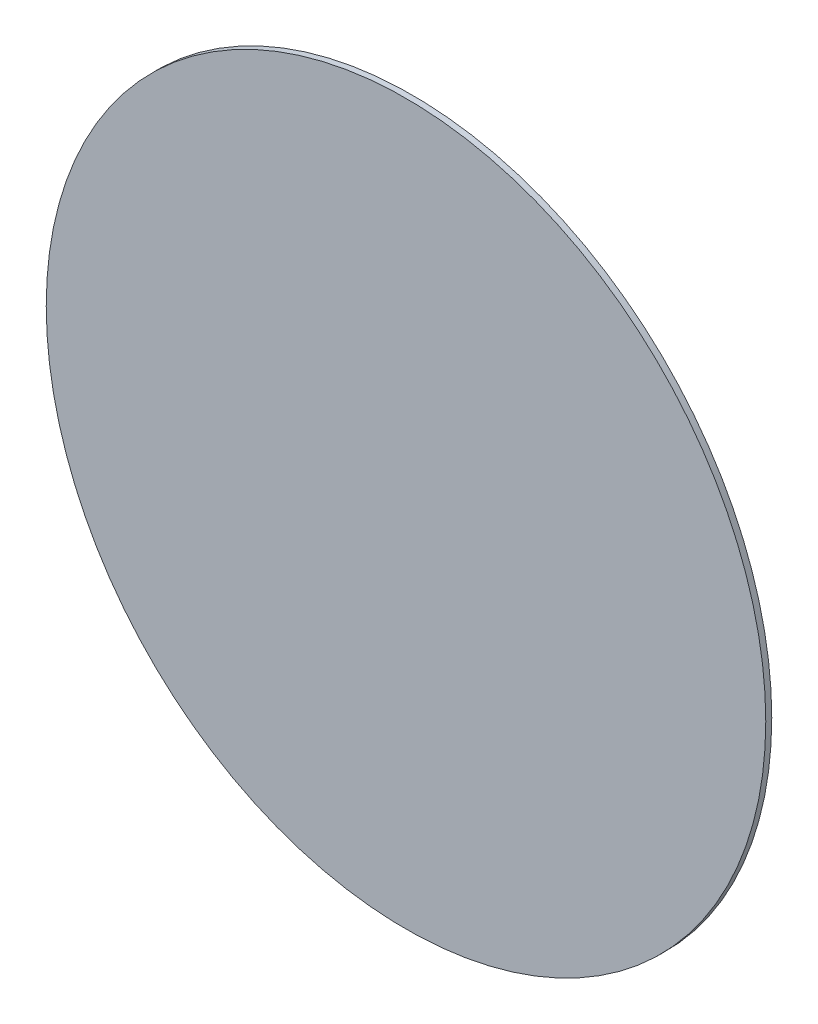
ISO-10303-21;
HEADER;
FILE_DESCRIPTION(('STEP AP214'),'2;1');
FILE_NAME('part.step','',(''),(''),'','','');
FILE_SCHEMA(('AUTOMOTIVE_DESIGN { 1 0 10303 214 1 1 1 1 }'));
ENDSEC;
DATA;
#1=APPLICATION_CONTEXT('core data for automotive mechanical design processes');
#2=APPLICATION_PROTOCOL_DEFINITION('international standard','automotive_design',2000,#1);
#3=PRODUCT_CONTEXT('',#1,'mechanical');
#4=PRODUCT('Part','Part','',(#3));
#5=PRODUCT_RELATED_PRODUCT_CATEGORY('part','',(#4));
#6=PRODUCT_DEFINITION_FORMATION('','',#4);
#7=PRODUCT_DEFINITION_CONTEXT('part definition',#1,'design');
#8=PRODUCT_DEFINITION('design','',#6,#7);
#9=PRODUCT_DEFINITION_SHAPE('','',#8);
#10=(LENGTH_UNIT() NAMED_UNIT(*) SI_UNIT(.MILLI.,.METRE.));
#11=(NAMED_UNIT(*) PLANE_ANGLE_UNIT() SI_UNIT($,.RADIAN.));
#12=(NAMED_UNIT(*) SI_UNIT($,.STERADIAN.) SOLID_ANGLE_UNIT());
#13=UNCERTAINTY_MEASURE_WITH_UNIT(LENGTH_MEASURE(1.E-05),#10,'distance_accuracy_value','');
#14=(GEOMETRIC_REPRESENTATION_CONTEXT(3) GLOBAL_UNCERTAINTY_ASSIGNED_CONTEXT((#13)) GLOBAL_UNIT_ASSIGNED_CONTEXT((#10,
#11,#12)) REPRESENTATION_CONTEXT('',''));
#15=CARTESIAN_POINT('',(0.,0.,0.));
#16=DIRECTION('',(0.,0.,1.));
#17=DIRECTION('',(1.,0.,0.));
#18=AXIS2_PLACEMENT_3D('',#15,#16,#17);
#19=CARTESIAN_POINT('',(0.3,0.,0.));
#20=DIRECTION('',(0.,0.,-1.));
#21=DIRECTION('',(-1.,0.,0.));
#22=AXIS2_PLACEMENT_3D('',#19,#20,#21);
#23=PLANE('',#22);
#24=CARTESIAN_POINT('',(0.,0.,0.));
#25=DIRECTION('',(0.,0.,-1.));
#26=DIRECTION('',(-1.,0.,0.));
#27=AXIS2_PLACEMENT_3D('',#24,#25,#26);
#28=CIRCLE('',#27,0.3);
#29=CARTESIAN_POINT('',(-0.3,0.,0.));
#30=VERTEX_POINT('',#29);
#31=EDGE_CURVE('E17',#30,#30,#28,.F.);
#32=ORIENTED_EDGE('',*,*,#31,.F.);
#33=EDGE_LOOP('',(#32));
#34=FACE_BOUND('',#33,.T.);
#35=ADVANCED_FACE('F14',(#34),#23,.T.);
#36=CARTESIAN_POINT('',(0.,0.,0.));
#37=DIRECTION('',(0.,0.,-1.));
#38=DIRECTION('',(-1.,0.,0.));
#39=AXIS2_PLACEMENT_3D('',#36,#37,#38);
#40=CYLINDRICAL_SURFACE('',#39,0.3);
#41=ORIENTED_EDGE('',*,*,#31,.T.);
#42=EDGE_LOOP('',(#41));
#43=FACE_BOUND('',#42,.T.);
#44=CARTESIAN_POINT('',(0.,0.,0.005));
#45=DIRECTION('',(0.,0.,-1.));
#46=DIRECTION('',(-1.,0.,0.));
#47=AXIS2_PLACEMENT_3D('',#44,#45,#46);
#48=CIRCLE('',#47,0.3);
#49=CARTESIAN_POINT('',(-0.3,0.,0.005));
#50=VERTEX_POINT('',#49);
#51=EDGE_CURVE('E10',#50,#50,#48,.T.);
#52=ORIENTED_EDGE('',*,*,#51,.T.);
#53=EDGE_LOOP('',(#52));
#54=FACE_BOUND('',#53,.T.);
#55=ADVANCED_FACE('F26',(#43,#54),#40,.T.);
#56=CARTESIAN_POINT('',(0.3,0.,0.005));
#57=DIRECTION('',(0.,0.,-1.));
#58=DIRECTION('',(-1.,0.,0.));
#59=AXIS2_PLACEMENT_3D('',#56,#57,#58);
#60=PLANE('',#59);
#61=ORIENTED_EDGE('',*,*,#51,.F.);
#62=EDGE_LOOP('',(#61));
#63=FACE_BOUND('',#62,.T.);
#64=ADVANCED_FACE('F33',(#63),#60,.F.);
#65=CLOSED_SHELL('',(#35,#55,#64));
#66=MANIFOLD_SOLID_BREP('B1',#65);
#67=ADVANCED_BREP_SHAPE_REPRESENTATION('',(#18,#66),#14);
#68=SHAPE_DEFINITION_REPRESENTATION(#9,#67);
ENDSEC;
END-ISO-10303-21;
